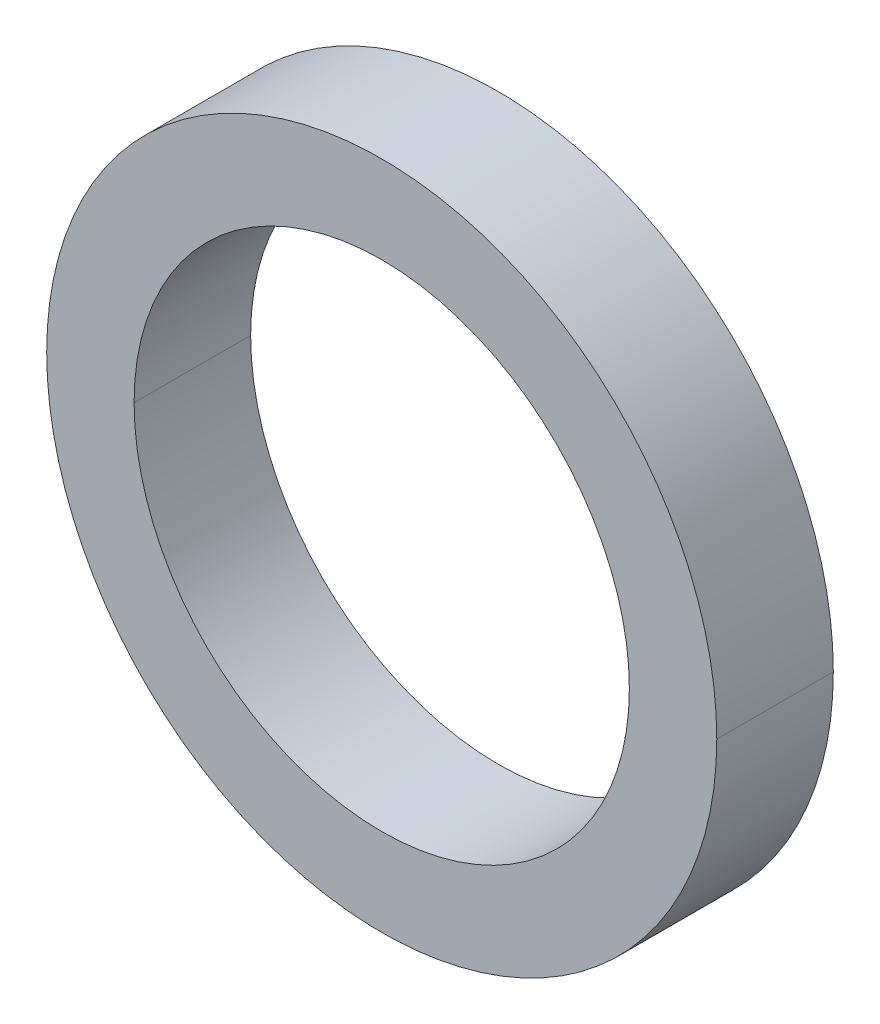
ISO-10303-21;
HEADER;
FILE_DESCRIPTION(('STEP AP214'),'2;1');
FILE_NAME('part.step','',(''),(''),'','','');
FILE_SCHEMA(('AUTOMOTIVE_DESIGN { 1 0 10303 214 1 1 1 1 }'));
ENDSEC;
DATA;
#1=APPLICATION_CONTEXT('core data for automotive mechanical design processes');
#2=APPLICATION_PROTOCOL_DEFINITION('international standard','automotive_design',2000,#1);
#3=PRODUCT_CONTEXT('',#1,'mechanical');
#4=PRODUCT('Part','Part','',(#3));
#5=PRODUCT_RELATED_PRODUCT_CATEGORY('part','',(#4));
#6=PRODUCT_DEFINITION_FORMATION('','',#4);
#7=PRODUCT_DEFINITION_CONTEXT('part definition',#1,'design');
#8=PRODUCT_DEFINITION('design','',#6,#7);
#9=PRODUCT_DEFINITION_SHAPE('','',#8);
#10=(LENGTH_UNIT() NAMED_UNIT(*) SI_UNIT(.MILLI.,.METRE.));
#11=(NAMED_UNIT(*) PLANE_ANGLE_UNIT() SI_UNIT($,.RADIAN.));
#12=(NAMED_UNIT(*) SI_UNIT($,.STERADIAN.) SOLID_ANGLE_UNIT());
#13=UNCERTAINTY_MEASURE_WITH_UNIT(LENGTH_MEASURE(1.E-05),#10,'distance_accuracy_value','');
#14=(GEOMETRIC_REPRESENTATION_CONTEXT(3) GLOBAL_UNCERTAINTY_ASSIGNED_CONTEXT((#13)) GLOBAL_UNIT_ASSIGNED_CONTEXT((#10,
#11,#12)) REPRESENTATION_CONTEXT('',''));
#15=CARTESIAN_POINT('',(0.,0.,0.));
#16=DIRECTION('',(0.,0.,1.));
#17=DIRECTION('',(1.,0.,0.));
#18=AXIS2_PLACEMENT_3D('',#15,#16,#17);
#19=CARTESIAN_POINT('',(0.,0.,4.));
#20=DIRECTION('',(0.,0.,-1.));
#21=DIRECTION('',(-1.,0.,0.));
#22=AXIS2_PLACEMENT_3D('',#19,#20,#21);
#23=CYLINDRICAL_SURFACE('',#22,8.5);
#24=CARTESIAN_POINT('',(0.,0.,4.));
#25=DIRECTION('',(0.,0.,1.));
#26=DIRECTION('',(1.,0.,0.));
#27=AXIS2_PLACEMENT_3D('',#24,#25,#26);
#28=CIRCLE('',#27,8.5);
#29=CARTESIAN_POINT('',(-8.5,0.,4.));
#30=VERTEX_POINT('',#29);
#31=CARTESIAN_POINT('',(8.5,0.,4.));
#32=VERTEX_POINT('',#31);
#33=EDGE_CURVE('E11',#30,#32,#28,.T.);
#34=ORIENTED_EDGE('',*,*,#33,.T.);
#35=DIRECTION('',(0.,0.,-1.));
#36=VECTOR('',#35,1.);
#37=CARTESIAN_POINT('',(8.5,0.,4.));
#38=LINE('',#37,#36);
#39=CARTESIAN_POINT('',(8.5,0.,0.));
#40=VERTEX_POINT('',#39);
#41=EDGE_CURVE('E26',#32,#40,#38,.T.);
#42=ORIENTED_EDGE('',*,*,#41,.T.);
#43=CARTESIAN_POINT('',(0.,0.,0.));
#44=DIRECTION('',(0.,0.,1.));
#45=DIRECTION('',(1.,0.,0.));
#46=AXIS2_PLACEMENT_3D('',#43,#44,#45);
#47=CIRCLE('',#46,8.5);
#48=CARTESIAN_POINT('',(-8.5,0.,0.));
#49=VERTEX_POINT('',#48);
#50=EDGE_CURVE('E51',#49,#40,#47,.T.);
#51=ORIENTED_EDGE('',*,*,#50,.F.);
#52=DIRECTION('',(0.,0.,-1.));
#53=VECTOR('',#52,1.);
#54=CARTESIAN_POINT('',(-8.5,0.,4.));
#55=LINE('',#54,#53);
#56=EDGE_CURVE('E70',#30,#49,#55,.T.);
#57=ORIENTED_EDGE('',*,*,#56,.F.);
#58=EDGE_LOOP('',(#34,#42,#51,#57));
#59=FACE_BOUND('',#58,.T.);
#60=ADVANCED_FACE('F16',(#59),#23,.F.);
#61=CARTESIAN_POINT('',(0.,0.,4.));
#62=DIRECTION('',(0.,0.,-1.));
#63=DIRECTION('',(-1.,0.,0.));
#64=AXIS2_PLACEMENT_3D('',#61,#62,#63);
#65=CYLINDRICAL_SURFACE('',#64,11.5);
#66=CARTESIAN_POINT('',(0.,0.,4.));
#67=DIRECTION('',(0.,0.,1.));
#68=DIRECTION('',(1.,0.,0.));
#69=AXIS2_PLACEMENT_3D('',#66,#67,#68);
#70=CIRCLE('',#69,11.5);
#71=CARTESIAN_POINT('',(11.5,0.,4.));
#72=VERTEX_POINT('',#71);
#73=CARTESIAN_POINT('',(-11.5,0.,4.));
#74=VERTEX_POINT('',#73);
#75=EDGE_CURVE('E97',#72,#74,#70,.T.);
#76=ORIENTED_EDGE('',*,*,#75,.F.);
#77=DIRECTION('',(0.,0.,-1.));
#78=VECTOR('',#77,1.);
#79=CARTESIAN_POINT('',(11.5,0.,4.));
#80=LINE('',#79,#78);
#81=CARTESIAN_POINT('',(11.5,0.,0.));
#82=VERTEX_POINT('',#81);
#83=EDGE_CURVE('E92',#72,#82,#80,.T.);
#84=ORIENTED_EDGE('',*,*,#83,.T.);
#85=CARTESIAN_POINT('',(0.,0.,0.));
#86=DIRECTION('',(0.,0.,1.));
#87=DIRECTION('',(1.,0.,0.));
#88=AXIS2_PLACEMENT_3D('',#85,#86,#87);
#89=CIRCLE('',#88,11.5);
#90=CARTESIAN_POINT('',(-11.5,0.,0.));
#91=VERTEX_POINT('',#90);
#92=EDGE_CURVE('E96',#82,#91,#89,.T.);
#93=ORIENTED_EDGE('',*,*,#92,.T.);
#94=DIRECTION('',(0.,0.,-1.));
#95=VECTOR('',#94,1.);
#96=CARTESIAN_POINT('',(-11.5,0.,4.));
#97=LINE('',#96,#95);
#98=EDGE_CURVE('E88',#74,#91,#97,.T.);
#99=ORIENTED_EDGE('',*,*,#98,.F.);
#100=EDGE_LOOP('',(#76,#84,#93,#99));
#101=FACE_BOUND('',#100,.T.);
#102=ADVANCED_FACE('F131',(#101),#65,.T.);
#103=CARTESIAN_POINT('',(0.,0.,4.));
#104=DIRECTION('',(0.,0.,1.));
#105=DIRECTION('',(1.,0.,0.));
#106=AXIS2_PLACEMENT_3D('',#103,#104,#105);
#107=PLANE('',#106);
#108=CARTESIAN_POINT('',(0.,0.,4.));
#109=DIRECTION('',(0.,0.,1.));
#110=DIRECTION('',(1.,0.,0.));
#111=AXIS2_PLACEMENT_3D('',#108,#109,#110);
#112=CIRCLE('',#111,11.5);
#113=EDGE_CURVE('E94',#74,#72,#112,.T.);
#114=ORIENTED_EDGE('',*,*,#113,.T.);
#115=ORIENTED_EDGE('',*,*,#75,.T.);
#116=EDGE_LOOP('',(#114,#115));
#117=FACE_BOUND('',#116,.T.);
#118=ORIENTED_EDGE('',*,*,#33,.F.);
#119=CARTESIAN_POINT('',(0.,0.,4.));
#120=DIRECTION('',(0.,0.,1.));
#121=DIRECTION('',(1.,0.,0.));
#122=AXIS2_PLACEMENT_3D('',#119,#120,#121);
#123=CIRCLE('',#122,8.5);
#124=EDGE_CURVE('E74',#32,#30,#123,.T.);
#125=ORIENTED_EDGE('',*,*,#124,.F.);
#126=EDGE_LOOP('',(#118,#125));
#127=FACE_BOUND('',#126,.T.);
#128=ADVANCED_FACE('F77',(#117,#127),#107,.T.);
#129=CARTESIAN_POINT('',(0.,0.,0.));
#130=DIRECTION('',(0.,0.,1.));
#131=DIRECTION('',(1.,0.,0.));
#132=AXIS2_PLACEMENT_3D('',#129,#130,#131);
#133=PLANE('',#132);
#134=CARTESIAN_POINT('',(0.,0.,0.));
#135=DIRECTION('',(0.,0.,1.));
#136=DIRECTION('',(1.,0.,0.));
#137=AXIS2_PLACEMENT_3D('',#134,#135,#136);
#138=CIRCLE('',#137,11.5);
#139=EDGE_CURVE('E80',#91,#82,#138,.T.);
#140=ORIENTED_EDGE('',*,*,#139,.F.);
#141=ORIENTED_EDGE('',*,*,#92,.F.);
#142=EDGE_LOOP('',(#140,#141));
#143=FACE_BOUND('',#142,.T.);
#144=ORIENTED_EDGE('',*,*,#50,.T.);
#145=CARTESIAN_POINT('',(0.,0.,0.));
#146=DIRECTION('',(0.,0.,1.));
#147=DIRECTION('',(1.,0.,0.));
#148=AXIS2_PLACEMENT_3D('',#145,#146,#147);
#149=CIRCLE('',#148,8.5);
#150=EDGE_CURVE('E20',#40,#49,#149,.T.);
#151=ORIENTED_EDGE('',*,*,#150,.T.);
#152=EDGE_LOOP('',(#144,#151));
#153=FACE_BOUND('',#152,.T.);
#154=ADVANCED_FACE('F189',(#143,#153),#133,.F.);
#155=CARTESIAN_POINT('',(0.,0.,4.));
#156=DIRECTION('',(0.,0.,-1.));
#157=DIRECTION('',(-1.,0.,0.));
#158=AXIS2_PLACEMENT_3D('',#155,#156,#157);
#159=CYLINDRICAL_SURFACE('',#158,11.5);
#160=ORIENTED_EDGE('',*,*,#83,.F.);
#161=ORIENTED_EDGE('',*,*,#113,.F.);
#162=ORIENTED_EDGE('',*,*,#98,.T.);
#163=ORIENTED_EDGE('',*,*,#139,.T.);
#164=EDGE_LOOP('',(#160,#161,#162,#163));
#165=FACE_BOUND('',#164,.T.);
#166=ADVANCED_FACE('F18',(#165),#159,.T.);
#167=CARTESIAN_POINT('',(0.,0.,4.));
#168=DIRECTION('',(0.,0.,-1.));
#169=DIRECTION('',(-1.,0.,0.));
#170=AXIS2_PLACEMENT_3D('',#167,#168,#169);
#171=CYLINDRICAL_SURFACE('',#170,8.5);
#172=ORIENTED_EDGE('',*,*,#41,.F.);
#173=ORIENTED_EDGE('',*,*,#124,.T.);
#174=ORIENTED_EDGE('',*,*,#56,.T.);
#175=ORIENTED_EDGE('',*,*,#150,.F.);
#176=EDGE_LOOP('',(#172,#173,#174,#175));
#177=FACE_BOUND('',#176,.T.);
#178=ADVANCED_FACE('F78',(#177),#171,.F.);
#179=CLOSED_SHELL('',(#60,#102,#128,#154,#166,#178));
#180=MANIFOLD_SOLID_BREP('B1',#179);
#181=ADVANCED_BREP_SHAPE_REPRESENTATION('',(#18,#180),#14);
#182=SHAPE_DEFINITION_REPRESENTATION(#9,#181);
ENDSEC;
END-ISO-10303-21;
